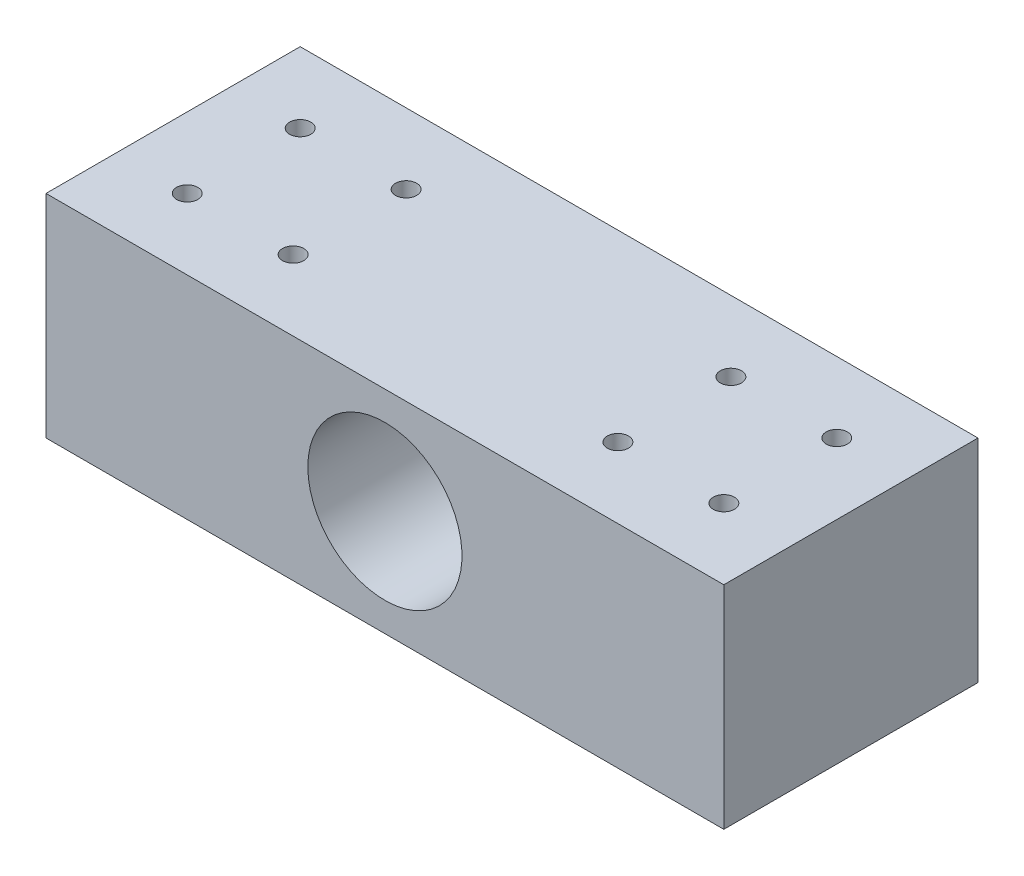
ISO-10303-21;
HEADER;
FILE_DESCRIPTION(('STEP AP214'),'2;1');
FILE_NAME('part.step','',(''),(''),'','','');
FILE_SCHEMA(('AUTOMOTIVE_DESIGN { 1 0 10303 214 1 1 1 1 }'));
ENDSEC;
DATA;
#1=APPLICATION_CONTEXT('core data for automotive mechanical design processes');
#2=APPLICATION_PROTOCOL_DEFINITION('international standard','automotive_design',2000,#1);
#3=PRODUCT_CONTEXT('',#1,'mechanical');
#4=PRODUCT('Part','Part','',(#3));
#5=PRODUCT_RELATED_PRODUCT_CATEGORY('part','',(#4));
#6=PRODUCT_DEFINITION_FORMATION('','',#4);
#7=PRODUCT_DEFINITION_CONTEXT('part definition',#1,'design');
#8=PRODUCT_DEFINITION('design','',#6,#7);
#9=PRODUCT_DEFINITION_SHAPE('','',#8);
#10=(LENGTH_UNIT() NAMED_UNIT(*) SI_UNIT(.MILLI.,.METRE.));
#11=(NAMED_UNIT(*) PLANE_ANGLE_UNIT() SI_UNIT($,.RADIAN.));
#12=(NAMED_UNIT(*) SI_UNIT($,.STERADIAN.) SOLID_ANGLE_UNIT());
#13=UNCERTAINTY_MEASURE_WITH_UNIT(LENGTH_MEASURE(1.E-05),#10,'distance_accuracy_value','');
#14=(GEOMETRIC_REPRESENTATION_CONTEXT(3) GLOBAL_UNCERTAINTY_ASSIGNED_CONTEXT((#13)) GLOBAL_UNIT_ASSIGNED_CONTEXT((#10,
#11,#12)) REPRESENTATION_CONTEXT('',''));
#15=CARTESIAN_POINT('',(0.,0.,0.));
#16=DIRECTION('',(0.,0.,1.));
#17=DIRECTION('',(1.,0.,0.));
#18=AXIS2_PLACEMENT_3D('',#15,#16,#17);
#19=CARTESIAN_POINT('',(0.,30.,0.));
#20=DIRECTION('',(0.,-1.,0.));
#21=DIRECTION('',(0.,0.,-1.));
#22=AXIS2_PLACEMENT_3D('',#19,#20,#21);
#23=PLANE('',#22);
#24=DIRECTION('',(0.,0.,1.));
#25=VECTOR('',#24,1.);
#26=CARTESIAN_POINT('',(0.,30.,0.));
#27=LINE('',#26,#25);
#28=CARTESIAN_POINT('',(0.,30.,-36.));
#29=VERTEX_POINT('',#28);
#30=CARTESIAN_POINT('',(0.,30.,0.));
#31=VERTEX_POINT('',#30);
#32=EDGE_CURVE('E88',#29,#31,#27,.T.);
#33=ORIENTED_EDGE('',*,*,#32,.T.);
#34=DIRECTION('',(1.,0.,0.));
#35=VECTOR('',#34,1.);
#36=CARTESIAN_POINT('',(0.,30.,0.));
#37=LINE('',#36,#35);
#38=CARTESIAN_POINT('',(96.,30.,0.));
#39=VERTEX_POINT('',#38);
#40=EDGE_CURVE('E83',#31,#39,#37,.T.);
#41=ORIENTED_EDGE('',*,*,#40,.T.);
#42=DIRECTION('',(0.,0.,-1.));
#43=VECTOR('',#42,1.);
#44=CARTESIAN_POINT('',(96.,30.,0.));
#45=LINE('',#44,#43);
#46=CARTESIAN_POINT('',(96.,30.,-36.));
#47=VERTEX_POINT('',#46);
#48=EDGE_CURVE('E86',#39,#47,#45,.T.);
#49=ORIENTED_EDGE('',*,*,#48,.T.);
#50=DIRECTION('',(-1.,0.,0.));
#51=VECTOR('',#50,1.);
#52=CARTESIAN_POINT('',(0.,30.,-36.));
#53=LINE('',#52,#51);
#54=EDGE_CURVE('E53',#47,#29,#53,.T.);
#55=ORIENTED_EDGE('',*,*,#54,.T.);
#56=EDGE_LOOP('',(#33,#41,#49,#55));
#57=FACE_BOUND('',#56,.T.);
#58=CARTESIAN_POINT('',(10.,30.,-26.));
#59=DIRECTION('',(0.,1.,0.));
#60=DIRECTION('',(0.,0.,1.));
#61=AXIS2_PLACEMENT_3D('',#58,#59,#60);
#62=CIRCLE('',#61,1.5);
#63=CARTESIAN_POINT('',(10.,30.,-24.5));
#64=VERTEX_POINT('',#63);
#65=EDGE_CURVE('E104',#64,#64,#62,.T.);
#66=ORIENTED_EDGE('',*,*,#65,.F.);
#67=EDGE_LOOP('',(#66));
#68=FACE_BOUND('',#67,.T.);
#69=CARTESIAN_POINT('',(25.,30.,-26.));
#70=DIRECTION('',(0.,1.,0.));
#71=DIRECTION('',(0.,0.,1.));
#72=AXIS2_PLACEMENT_3D('',#69,#70,#71);
#73=CIRCLE('',#72,1.5);
#74=CARTESIAN_POINT('',(25.,30.,-24.5));
#75=VERTEX_POINT('',#74);
#76=EDGE_CURVE('E119',#75,#75,#73,.T.);
#77=ORIENTED_EDGE('',*,*,#76,.F.);
#78=EDGE_LOOP('',(#77));
#79=FACE_BOUND('',#78,.T.);
#80=CARTESIAN_POINT('',(25.,30.,-10.));
#81=DIRECTION('',(0.,1.,0.));
#82=DIRECTION('',(0.,0.,1.));
#83=AXIS2_PLACEMENT_3D('',#80,#81,#82);
#84=CIRCLE('',#83,1.5);
#85=CARTESIAN_POINT('',(25.,30.,-8.5));
#86=VERTEX_POINT('',#85);
#87=EDGE_CURVE('E125',#86,#86,#84,.T.);
#88=ORIENTED_EDGE('',*,*,#87,.F.);
#89=EDGE_LOOP('',(#88));
#90=FACE_BOUND('',#89,.T.);
#91=CARTESIAN_POINT('',(10.,30.,-10.));
#92=DIRECTION('',(0.,1.,0.));
#93=DIRECTION('',(0.,0.,1.));
#94=AXIS2_PLACEMENT_3D('',#91,#92,#93);
#95=CIRCLE('',#94,1.5);
#96=CARTESIAN_POINT('',(10.,30.,-8.5));
#97=VERTEX_POINT('',#96);
#98=EDGE_CURVE('E131',#97,#97,#95,.T.);
#99=ORIENTED_EDGE('',*,*,#98,.F.);
#100=EDGE_LOOP('',(#99));
#101=FACE_BOUND('',#100,.T.);
#102=CARTESIAN_POINT('',(86.,30.,-26.));
#103=DIRECTION('',(0.,1.,0.));
#104=DIRECTION('',(0.,0.,-1.));
#105=AXIS2_PLACEMENT_3D('',#102,#103,#104);
#106=CIRCLE('',#105,1.5);
#107=CARTESIAN_POINT('',(86.,30.,-27.5));
#108=VERTEX_POINT('',#107);
#109=EDGE_CURVE('E137',#108,#108,#106,.T.);
#110=ORIENTED_EDGE('',*,*,#109,.F.);
#111=EDGE_LOOP('',(#110));
#112=FACE_BOUND('',#111,.T.);
#113=CARTESIAN_POINT('',(86.,30.,-10.));
#114=DIRECTION('',(0.,1.,0.));
#115=DIRECTION('',(0.,0.,-1.));
#116=AXIS2_PLACEMENT_3D('',#113,#114,#115);
#117=CIRCLE('',#116,1.5);
#118=CARTESIAN_POINT('',(86.,30.,-11.5));
#119=VERTEX_POINT('',#118);
#120=EDGE_CURVE('E143',#119,#119,#117,.T.);
#121=ORIENTED_EDGE('',*,*,#120,.F.);
#122=EDGE_LOOP('',(#121));
#123=FACE_BOUND('',#122,.T.);
#124=CARTESIAN_POINT('',(71.,30.,-10.));
#125=DIRECTION('',(0.,1.,0.));
#126=DIRECTION('',(0.,0.,-1.));
#127=AXIS2_PLACEMENT_3D('',#124,#125,#126);
#128=CIRCLE('',#127,1.50000000000001);
#129=CARTESIAN_POINT('',(71.,30.,-11.5));
#130=VERTEX_POINT('',#129);
#131=EDGE_CURVE('E149',#130,#130,#128,.T.);
#132=ORIENTED_EDGE('',*,*,#131,.F.);
#133=EDGE_LOOP('',(#132));
#134=FACE_BOUND('',#133,.T.);
#135=CARTESIAN_POINT('',(71.,30.,-26.));
#136=DIRECTION('',(0.,1.,0.));
#137=DIRECTION('',(0.,0.,-1.));
#138=AXIS2_PLACEMENT_3D('',#135,#136,#137);
#139=CIRCLE('',#138,1.50000000000001);
#140=CARTESIAN_POINT('',(71.,30.,-27.5));
#141=VERTEX_POINT('',#140);
#142=EDGE_CURVE('E155',#141,#141,#139,.T.);
#143=ORIENTED_EDGE('',*,*,#142,.F.);
#144=EDGE_LOOP('',(#143));
#145=FACE_BOUND('',#144,.T.);
#146=ADVANCED_FACE('F35',(#57,#68,#79,#90,#101,#112,#123,#134,#145),#23,.F.);
#147=CARTESIAN_POINT('',(0.,0.,0.));
#148=DIRECTION('',(0.,-1.,0.));
#149=DIRECTION('',(0.,0.,-1.));
#150=AXIS2_PLACEMENT_3D('',#147,#148,#149);
#151=PLANE('',#150);
#152=CARTESIAN_POINT('',(71.,0.,-10.));
#153=DIRECTION('',(0.,1.,0.));
#154=DIRECTION('',(0.,0.,-1.));
#155=AXIS2_PLACEMENT_3D('',#152,#153,#154);
#156=CIRCLE('',#155,1.50000000000001);
#157=CARTESIAN_POINT('',(71.,0.,-11.5));
#158=VERTEX_POINT('',#157);
#159=EDGE_CURVE('E152',#158,#158,#156,.T.);
#160=ORIENTED_EDGE('',*,*,#159,.T.);
#161=EDGE_LOOP('',(#160));
#162=FACE_BOUND('',#161,.T.);
#163=CARTESIAN_POINT('',(86.,0.,-26.));
#164=DIRECTION('',(0.,1.,0.));
#165=DIRECTION('',(0.,0.,-1.));
#166=AXIS2_PLACEMENT_3D('',#163,#164,#165);
#167=CIRCLE('',#166,1.5);
#168=CARTESIAN_POINT('',(86.,0.,-27.5));
#169=VERTEX_POINT('',#168);
#170=EDGE_CURVE('E140',#169,#169,#167,.T.);
#171=ORIENTED_EDGE('',*,*,#170,.T.);
#172=EDGE_LOOP('',(#171));
#173=FACE_BOUND('',#172,.T.);
#174=CARTESIAN_POINT('',(25.,0.,-10.));
#175=DIRECTION('',(0.,1.,0.));
#176=DIRECTION('',(0.,0.,1.));
#177=AXIS2_PLACEMENT_3D('',#174,#175,#176);
#178=CIRCLE('',#177,1.5);
#179=CARTESIAN_POINT('',(25.,0.,-8.5));
#180=VERTEX_POINT('',#179);
#181=EDGE_CURVE('E128',#180,#180,#178,.T.);
#182=ORIENTED_EDGE('',*,*,#181,.T.);
#183=EDGE_LOOP('',(#182));
#184=FACE_BOUND('',#183,.T.);
#185=CARTESIAN_POINT('',(10.,0.,-26.));
#186=DIRECTION('',(0.,1.,0.));
#187=DIRECTION('',(0.,0.,1.));
#188=AXIS2_PLACEMENT_3D('',#185,#186,#187);
#189=CIRCLE('',#188,1.5);
#190=CARTESIAN_POINT('',(10.,0.,-24.5));
#191=VERTEX_POINT('',#190);
#192=EDGE_CURVE('E116',#191,#191,#189,.T.);
#193=ORIENTED_EDGE('',*,*,#192,.T.);
#194=EDGE_LOOP('',(#193));
#195=FACE_BOUND('',#194,.T.);
#196=DIRECTION('',(0.,0.,1.));
#197=VECTOR('',#196,1.);
#198=CARTESIAN_POINT('',(0.,0.,0.));
#199=LINE('',#198,#197);
#200=CARTESIAN_POINT('',(0.,0.,-36.));
#201=VERTEX_POINT('',#200);
#202=CARTESIAN_POINT('',(0.,0.,0.));
#203=VERTEX_POINT('',#202);
#204=EDGE_CURVE('E101',#201,#203,#199,.T.);
#205=ORIENTED_EDGE('',*,*,#204,.F.);
#206=DIRECTION('',(-1.,0.,0.));
#207=VECTOR('',#206,1.);
#208=CARTESIAN_POINT('',(0.,0.,-36.));
#209=LINE('',#208,#207);
#210=CARTESIAN_POINT('',(96.,0.,-36.));
#211=VERTEX_POINT('',#210);
#212=EDGE_CURVE('E76',#211,#201,#209,.T.);
#213=ORIENTED_EDGE('',*,*,#212,.F.);
#214=DIRECTION('',(0.,0.,-1.));
#215=VECTOR('',#214,1.);
#216=CARTESIAN_POINT('',(96.,0.,0.));
#217=LINE('',#216,#215);
#218=CARTESIAN_POINT('',(96.,0.,0.));
#219=VERTEX_POINT('',#218);
#220=EDGE_CURVE('E70',#219,#211,#217,.T.);
#221=ORIENTED_EDGE('',*,*,#220,.F.);
#222=DIRECTION('',(1.,0.,0.));
#223=VECTOR('',#222,1.);
#224=CARTESIAN_POINT('',(0.,0.,0.));
#225=LINE('',#224,#223);
#226=EDGE_CURVE('E92',#203,#219,#225,.T.);
#227=ORIENTED_EDGE('',*,*,#226,.F.);
#228=EDGE_LOOP('',(#205,#213,#221,#227));
#229=FACE_BOUND('',#228,.T.);
#230=CARTESIAN_POINT('',(25.,0.,-26.));
#231=DIRECTION('',(0.,1.,0.));
#232=DIRECTION('',(0.,0.,1.));
#233=AXIS2_PLACEMENT_3D('',#230,#231,#232);
#234=CIRCLE('',#233,1.5);
#235=CARTESIAN_POINT('',(25.,0.,-24.5));
#236=VERTEX_POINT('',#235);
#237=EDGE_CURVE('E122',#236,#236,#234,.T.);
#238=ORIENTED_EDGE('',*,*,#237,.T.);
#239=EDGE_LOOP('',(#238));
#240=FACE_BOUND('',#239,.T.);
#241=CARTESIAN_POINT('',(10.,0.,-10.));
#242=DIRECTION('',(0.,1.,0.));
#243=DIRECTION('',(0.,0.,1.));
#244=AXIS2_PLACEMENT_3D('',#241,#242,#243);
#245=CIRCLE('',#244,1.5);
#246=CARTESIAN_POINT('',(10.,0.,-8.5));
#247=VERTEX_POINT('',#246);
#248=EDGE_CURVE('E134',#247,#247,#245,.T.);
#249=ORIENTED_EDGE('',*,*,#248,.T.);
#250=EDGE_LOOP('',(#249));
#251=FACE_BOUND('',#250,.T.);
#252=CARTESIAN_POINT('',(86.,0.,-10.));
#253=DIRECTION('',(0.,1.,0.));
#254=DIRECTION('',(0.,0.,-1.));
#255=AXIS2_PLACEMENT_3D('',#252,#253,#254);
#256=CIRCLE('',#255,1.5);
#257=CARTESIAN_POINT('',(86.,0.,-11.5));
#258=VERTEX_POINT('',#257);
#259=EDGE_CURVE('E146',#258,#258,#256,.T.);
#260=ORIENTED_EDGE('',*,*,#259,.T.);
#261=EDGE_LOOP('',(#260));
#262=FACE_BOUND('',#261,.T.);
#263=CARTESIAN_POINT('',(71.,0.,-26.));
#264=DIRECTION('',(0.,1.,0.));
#265=DIRECTION('',(0.,0.,-1.));
#266=AXIS2_PLACEMENT_3D('',#263,#264,#265);
#267=CIRCLE('',#266,1.50000000000001);
#268=CARTESIAN_POINT('',(71.,0.,-27.5));
#269=VERTEX_POINT('',#268);
#270=EDGE_CURVE('E158',#269,#269,#267,.T.);
#271=ORIENTED_EDGE('',*,*,#270,.T.);
#272=EDGE_LOOP('',(#271));
#273=FACE_BOUND('',#272,.T.);
#274=ADVANCED_FACE('F112',(#162,#173,#184,#195,#229,#240,#251,#262,#273),#151,.T.);
#275=CARTESIAN_POINT('',(0.,30.,0.));
#276=DIRECTION('',(1.,0.,0.));
#277=DIRECTION('',(0.,0.,-1.));
#278=AXIS2_PLACEMENT_3D('',#275,#276,#277);
#279=PLANE('',#278);
#280=ORIENTED_EDGE('',*,*,#204,.T.);
#281=DIRECTION('',(0.,-1.,0.));
#282=VECTOR('',#281,1.);
#283=CARTESIAN_POINT('',(0.,30.,0.));
#284=LINE('',#283,#282);
#285=EDGE_CURVE('E11',#31,#203,#284,.T.);
#286=ORIENTED_EDGE('',*,*,#285,.F.);
#287=ORIENTED_EDGE('',*,*,#32,.F.);
#288=DIRECTION('',(0.,-1.,0.));
#289=VECTOR('',#288,1.);
#290=CARTESIAN_POINT('',(0.,30.,-36.));
#291=LINE('',#290,#289);
#292=EDGE_CURVE('E97',#29,#201,#291,.T.);
#293=ORIENTED_EDGE('',*,*,#292,.T.);
#294=EDGE_LOOP('',(#280,#286,#287,#293));
#295=FACE_BOUND('',#294,.T.);
#296=ADVANCED_FACE('F37',(#295),#279,.F.);
#297=CARTESIAN_POINT('',(0.,30.,0.));
#298=DIRECTION('',(0.,0.,-1.));
#299=DIRECTION('',(-1.,0.,0.));
#300=AXIS2_PLACEMENT_3D('',#297,#298,#299);
#301=PLANE('',#300);
#302=CARTESIAN_POINT('',(48.,15.,0.));
#303=DIRECTION('',(0.,0.,-1.));
#304=DIRECTION('',(-1.,0.,0.));
#305=AXIS2_PLACEMENT_3D('',#302,#303,#304);
#306=CIRCLE('',#305,10.9175021727131);
#307=CARTESIAN_POINT('',(37.082497827287,15.,0.));
#308=VERTEX_POINT('',#307);
#309=EDGE_CURVE('E163',#308,#308,#306,.T.);
#310=ORIENTED_EDGE('',*,*,#309,.T.);
#311=EDGE_LOOP('',(#310));
#312=FACE_BOUND('',#311,.T.);
#313=ORIENTED_EDGE('',*,*,#226,.T.);
#314=DIRECTION('',(0.,-1.,0.));
#315=VECTOR('',#314,1.);
#316=CARTESIAN_POINT('',(96.,30.,0.));
#317=LINE('',#316,#315);
#318=EDGE_CURVE('E45',#39,#219,#317,.T.);
#319=ORIENTED_EDGE('',*,*,#318,.F.);
#320=ORIENTED_EDGE('',*,*,#40,.F.);
#321=ORIENTED_EDGE('',*,*,#285,.T.);
#322=EDGE_LOOP('',(#313,#319,#320,#321));
#323=FACE_BOUND('',#322,.T.);
#324=ADVANCED_FACE('F91',(#312,#323),#301,.F.);
#325=CARTESIAN_POINT('',(96.,30.,0.));
#326=DIRECTION('',(-1.,0.,0.));
#327=DIRECTION('',(0.,0.,1.));
#328=AXIS2_PLACEMENT_3D('',#325,#326,#327);
#329=PLANE('',#328);
#330=ORIENTED_EDGE('',*,*,#220,.T.);
#331=DIRECTION('',(0.,-1.,0.));
#332=VECTOR('',#331,1.);
#333=CARTESIAN_POINT('',(96.,30.,-36.));
#334=LINE('',#333,#332);
#335=EDGE_CURVE('E93',#47,#211,#334,.T.);
#336=ORIENTED_EDGE('',*,*,#335,.F.);
#337=ORIENTED_EDGE('',*,*,#48,.F.);
#338=ORIENTED_EDGE('',*,*,#318,.T.);
#339=EDGE_LOOP('',(#330,#336,#337,#338));
#340=FACE_BOUND('',#339,.T.);
#341=ADVANCED_FACE('F95',(#340),#329,.F.);
#342=CARTESIAN_POINT('',(0.,30.,-36.));
#343=DIRECTION('',(0.,0.,1.));
#344=DIRECTION('',(1.,0.,0.));
#345=AXIS2_PLACEMENT_3D('',#342,#343,#344);
#346=PLANE('',#345);
#347=CARTESIAN_POINT('',(48.,15.,-36.));
#348=DIRECTION('',(0.,0.,1.));
#349=DIRECTION('',(1.,0.,0.));
#350=AXIS2_PLACEMENT_3D('',#347,#348,#349);
#351=CIRCLE('',#350,10.9175021727131);
#352=CARTESIAN_POINT('',(58.9175021727131,15.,-36.));
#353=VERTEX_POINT('',#352);
#354=EDGE_CURVE('E39',#353,#353,#351,.T.);
#355=ORIENTED_EDGE('',*,*,#354,.T.);
#356=EDGE_LOOP('',(#355));
#357=FACE_BOUND('',#356,.T.);
#358=ORIENTED_EDGE('',*,*,#212,.T.);
#359=ORIENTED_EDGE('',*,*,#292,.F.);
#360=ORIENTED_EDGE('',*,*,#54,.F.);
#361=ORIENTED_EDGE('',*,*,#335,.T.);
#362=EDGE_LOOP('',(#358,#359,#360,#361));
#363=FACE_BOUND('',#362,.T.);
#364=ADVANCED_FACE('F109',(#357,#363),#346,.F.);
#365=CARTESIAN_POINT('',(10.,30.,-26.));
#366=DIRECTION('',(0.,-1.,0.));
#367=DIRECTION('',(0.,0.,-1.));
#368=AXIS2_PLACEMENT_3D('',#365,#366,#367);
#369=CYLINDRICAL_SURFACE('',#368,1.5);
#370=ORIENTED_EDGE('',*,*,#65,.T.);
#371=EDGE_LOOP('',(#370));
#372=FACE_BOUND('',#371,.T.);
#373=ORIENTED_EDGE('',*,*,#192,.F.);
#374=EDGE_LOOP('',(#373));
#375=FACE_BOUND('',#374,.T.);
#376=ADVANCED_FACE('F190',(#372,#375),#369,.F.);
#377=CARTESIAN_POINT('',(25.,30.,-26.));
#378=DIRECTION('',(0.,-1.,0.));
#379=DIRECTION('',(0.,0.,-1.));
#380=AXIS2_PLACEMENT_3D('',#377,#378,#379);
#381=CYLINDRICAL_SURFACE('',#380,1.5);
#382=ORIENTED_EDGE('',*,*,#76,.T.);
#383=EDGE_LOOP('',(#382));
#384=FACE_BOUND('',#383,.T.);
#385=ORIENTED_EDGE('',*,*,#237,.F.);
#386=EDGE_LOOP('',(#385));
#387=FACE_BOUND('',#386,.T.);
#388=ADVANCED_FACE('F237',(#384,#387),#381,.F.);
#389=CARTESIAN_POINT('',(25.,30.,-10.));
#390=DIRECTION('',(0.,-1.,0.));
#391=DIRECTION('',(0.,0.,-1.));
#392=AXIS2_PLACEMENT_3D('',#389,#390,#391);
#393=CYLINDRICAL_SURFACE('',#392,1.5);
#394=ORIENTED_EDGE('',*,*,#87,.T.);
#395=EDGE_LOOP('',(#394));
#396=FACE_BOUND('',#395,.T.);
#397=ORIENTED_EDGE('',*,*,#181,.F.);
#398=EDGE_LOOP('',(#397));
#399=FACE_BOUND('',#398,.T.);
#400=ADVANCED_FACE('F245',(#396,#399),#393,.F.);
#401=CARTESIAN_POINT('',(10.,30.,-10.));
#402=DIRECTION('',(0.,-1.,0.));
#403=DIRECTION('',(0.,0.,-1.));
#404=AXIS2_PLACEMENT_3D('',#401,#402,#403);
#405=CYLINDRICAL_SURFACE('',#404,1.5);
#406=ORIENTED_EDGE('',*,*,#98,.T.);
#407=EDGE_LOOP('',(#406));
#408=FACE_BOUND('',#407,.T.);
#409=ORIENTED_EDGE('',*,*,#248,.F.);
#410=EDGE_LOOP('',(#409));
#411=FACE_BOUND('',#410,.T.);
#412=ADVANCED_FACE('F253',(#408,#411),#405,.F.);
#413=CARTESIAN_POINT('',(86.,30.,-26.));
#414=DIRECTION('',(0.,-1.,0.));
#415=DIRECTION('',(0.,0.,-1.));
#416=AXIS2_PLACEMENT_3D('',#413,#414,#415);
#417=CYLINDRICAL_SURFACE('',#416,1.5);
#418=ORIENTED_EDGE('',*,*,#109,.T.);
#419=EDGE_LOOP('',(#418));
#420=FACE_BOUND('',#419,.T.);
#421=ORIENTED_EDGE('',*,*,#170,.F.);
#422=EDGE_LOOP('',(#421));
#423=FACE_BOUND('',#422,.T.);
#424=ADVANCED_FACE('F262',(#420,#423),#417,.F.);
#425=CARTESIAN_POINT('',(86.,30.,-10.));
#426=DIRECTION('',(0.,-1.,0.));
#427=DIRECTION('',(0.,0.,-1.));
#428=AXIS2_PLACEMENT_3D('',#425,#426,#427);
#429=CYLINDRICAL_SURFACE('',#428,1.5);
#430=ORIENTED_EDGE('',*,*,#120,.T.);
#431=EDGE_LOOP('',(#430));
#432=FACE_BOUND('',#431,.T.);
#433=ORIENTED_EDGE('',*,*,#259,.F.);
#434=EDGE_LOOP('',(#433));
#435=FACE_BOUND('',#434,.T.);
#436=ADVANCED_FACE('F271',(#432,#435),#429,.F.);
#437=CARTESIAN_POINT('',(71.,30.,-10.));
#438=DIRECTION('',(0.,-1.,0.));
#439=DIRECTION('',(0.,0.,-1.));
#440=AXIS2_PLACEMENT_3D('',#437,#438,#439);
#441=CYLINDRICAL_SURFACE('',#440,1.50000000000001);
#442=ORIENTED_EDGE('',*,*,#131,.T.);
#443=EDGE_LOOP('',(#442));
#444=FACE_BOUND('',#443,.T.);
#445=ORIENTED_EDGE('',*,*,#159,.F.);
#446=EDGE_LOOP('',(#445));
#447=FACE_BOUND('',#446,.T.);
#448=ADVANCED_FACE('F179',(#444,#447),#441,.F.);
#449=CARTESIAN_POINT('',(71.,30.,-26.));
#450=DIRECTION('',(0.,-1.,0.));
#451=DIRECTION('',(0.,0.,-1.));
#452=AXIS2_PLACEMENT_3D('',#449,#450,#451);
#453=CYLINDRICAL_SURFACE('',#452,1.50000000000001);
#454=ORIENTED_EDGE('',*,*,#142,.T.);
#455=EDGE_LOOP('',(#454));
#456=FACE_BOUND('',#455,.T.);
#457=ORIENTED_EDGE('',*,*,#270,.F.);
#458=EDGE_LOOP('',(#457));
#459=FACE_BOUND('',#458,.T.);
#460=ADVANCED_FACE('F173',(#456,#459),#453,.F.);
#461=CARTESIAN_POINT('',(48.,15.,0.));
#462=DIRECTION('',(0.,0.,-1.));
#463=DIRECTION('',(-1.,0.,0.));
#464=AXIS2_PLACEMENT_3D('',#461,#462,#463);
#465=CYLINDRICAL_SURFACE('',#464,10.9175021727131);
#466=ORIENTED_EDGE('',*,*,#309,.F.);
#467=EDGE_LOOP('',(#466));
#468=FACE_BOUND('',#467,.T.);
#469=ORIENTED_EDGE('',*,*,#354,.F.);
#470=EDGE_LOOP('',(#469));
#471=FACE_BOUND('',#470,.T.);
#472=ADVANCED_FACE('F171',(#468,#471),#465,.F.);
#473=CLOSED_SHELL('',(#146,#274,#296,#324,#341,#364,#376,#388,#400,#412,#424,#436,#448,#460,#472));
#474=MANIFOLD_SOLID_BREP('B2',#473);
#475=ADVANCED_BREP_SHAPE_REPRESENTATION('',(#18,#474),#14);
#476=SHAPE_DEFINITION_REPRESENTATION(#9,#475);
ENDSEC;
END-ISO-10303-21;
